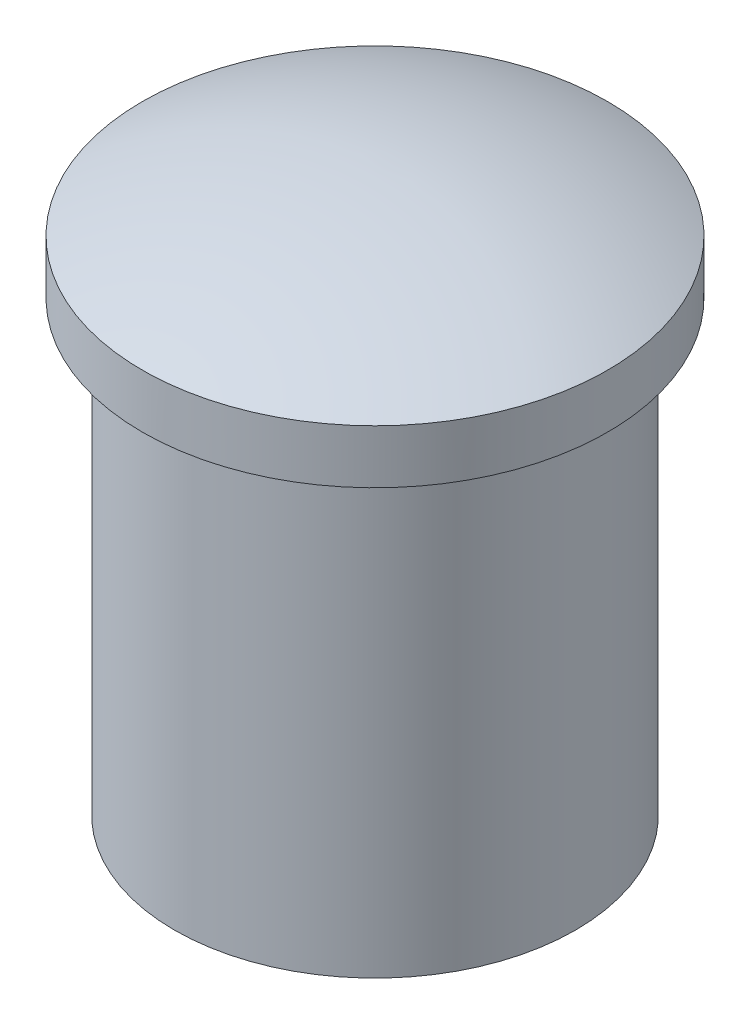
ISO-10303-21;
HEADER;
FILE_DESCRIPTION(('STEP AP214'),'2;1');
FILE_NAME('part.step','',(''),(''),'','','');
FILE_SCHEMA(('AUTOMOTIVE_DESIGN { 1 0 10303 214 1 1 1 1 }'));
ENDSEC;
DATA;
#1=APPLICATION_CONTEXT('core data for automotive mechanical design processes');
#2=APPLICATION_PROTOCOL_DEFINITION('international standard','automotive_design',2000,#1);
#3=PRODUCT_CONTEXT('',#1,'mechanical');
#4=PRODUCT('Part','Part','',(#3));
#5=PRODUCT_RELATED_PRODUCT_CATEGORY('part','',(#4));
#6=PRODUCT_DEFINITION_FORMATION('','',#4);
#7=PRODUCT_DEFINITION_CONTEXT('part definition',#1,'design');
#8=PRODUCT_DEFINITION('design','',#6,#7);
#9=PRODUCT_DEFINITION_SHAPE('','',#8);
#10=(LENGTH_UNIT() NAMED_UNIT(*) SI_UNIT(.MILLI.,.METRE.));
#11=(NAMED_UNIT(*) PLANE_ANGLE_UNIT() SI_UNIT($,.RADIAN.));
#12=(NAMED_UNIT(*) SI_UNIT($,.STERADIAN.) SOLID_ANGLE_UNIT());
#13=UNCERTAINTY_MEASURE_WITH_UNIT(LENGTH_MEASURE(1.E-05),#10,'distance_accuracy_value','');
#14=(GEOMETRIC_REPRESENTATION_CONTEXT(3) GLOBAL_UNCERTAINTY_ASSIGNED_CONTEXT((#13)) GLOBAL_UNIT_ASSIGNED_CONTEXT((#10,
#11,#12)) REPRESENTATION_CONTEXT('',''));
#15=CARTESIAN_POINT('',(0.,0.,0.));
#16=DIRECTION('',(0.,0.,1.));
#17=DIRECTION('',(1.,0.,0.));
#18=AXIS2_PLACEMENT_3D('',#15,#16,#17);
#19=CARTESIAN_POINT('',(0.,-5.461,0.));
#20=DIRECTION('',(0.,-1.,0.));
#21=DIRECTION('',(-1.,0.,0.));
#22=AXIS2_PLACEMENT_3D('',#19,#20,#21);
#23=SPHERICAL_SURFACE('',#22,2.6924);
#24=CARTESIAN_POINT('',(0.,-3.175,0.));
#25=DIRECTION('',(0.,-1.,0.));
#26=DIRECTION('',(0.,0.,-1.));
#27=AXIS2_PLACEMENT_3D('',#24,#25,#26);
#28=CIRCLE('',#27,1.4224);
#29=CARTESIAN_POINT('',(0.,-3.175,-1.4224));
#30=VERTEX_POINT('',#29);
#31=EDGE_CURVE('E10',#30,#30,#28,.T.);
#32=ORIENTED_EDGE('',*,*,#31,.T.);
#33=EDGE_LOOP('',(#32));
#34=FACE_BOUND('',#33,.T.);
#35=ADVANCED_FACE('F35',(#34),#23,.F.);
#36=CARTESIAN_POINT('',(0.,-2.7686,0.));
#37=DIRECTION('',(0.,-1.,0.));
#38=DIRECTION('',(0.,0.,-1.));
#39=AXIS2_PLACEMENT_3D('',#36,#37,#38);
#40=CYLINDRICAL_SURFACE('',#39,1.4224);
#41=ORIENTED_EDGE('',*,*,#31,.F.);
#42=EDGE_LOOP('',(#41));
#43=FACE_BOUND('',#42,.T.);
#44=CARTESIAN_POINT('',(0.,0.,0.));
#45=DIRECTION('',(0.,-1.,0.));
#46=DIRECTION('',(0.,0.,-1.));
#47=AXIS2_PLACEMENT_3D('',#44,#45,#46);
#48=CIRCLE('',#47,1.4224);
#49=CARTESIAN_POINT('',(0.,0.,-1.4224));
#50=VERTEX_POINT('',#49);
#51=EDGE_CURVE('E41',#50,#50,#48,.T.);
#52=ORIENTED_EDGE('',*,*,#51,.T.);
#53=EDGE_LOOP('',(#52));
#54=FACE_BOUND('',#53,.T.);
#55=ADVANCED_FACE('F67',(#43,#54),#40,.T.);
#56=CARTESIAN_POINT('',(-1.651,0.,0.));
#57=DIRECTION('',(0.,1.,0.));
#58=DIRECTION('',(0.,0.,1.));
#59=AXIS2_PLACEMENT_3D('',#56,#57,#58);
#60=PLANE('',#59);
#61=ORIENTED_EDGE('',*,*,#51,.F.);
#62=EDGE_LOOP('',(#61));
#63=FACE_BOUND('',#62,.T.);
#64=CARTESIAN_POINT('',(0.,0.,0.));
#65=DIRECTION('',(0.,-1.,0.));
#66=DIRECTION('',(0.,0.,-1.));
#67=AXIS2_PLACEMENT_3D('',#64,#65,#66);
#68=CIRCLE('',#67,1.651);
#69=CARTESIAN_POINT('',(0.,0.,-1.651));
#70=VERTEX_POINT('',#69);
#71=EDGE_CURVE('E45',#70,#70,#68,.T.);
#72=ORIENTED_EDGE('',*,*,#71,.T.);
#73=EDGE_LOOP('',(#72));
#74=FACE_BOUND('',#73,.T.);
#75=ADVANCED_FACE('F63',(#63,#74),#60,.F.);
#76=CARTESIAN_POINT('',(0.,-2.7686,0.));
#77=DIRECTION('',(0.,-1.,0.));
#78=DIRECTION('',(0.,0.,-1.));
#79=AXIS2_PLACEMENT_3D('',#76,#77,#78);
#80=CYLINDRICAL_SURFACE('',#79,1.651);
#81=ORIENTED_EDGE('',*,*,#71,.F.);
#82=EDGE_LOOP('',(#81));
#83=FACE_BOUND('',#82,.T.);
#84=CARTESIAN_POINT('',(0.,0.381,0.));
#85=DIRECTION('',(0.,-1.,0.));
#86=DIRECTION('',(0.,0.,-1.));
#87=AXIS2_PLACEMENT_3D('',#84,#85,#86);
#88=CIRCLE('',#87,1.651);
#89=CARTESIAN_POINT('',(0.,0.381,-1.651));
#90=VERTEX_POINT('',#89);
#91=EDGE_CURVE('E49',#90,#90,#88,.T.);
#92=ORIENTED_EDGE('',*,*,#91,.T.);
#93=EDGE_LOOP('',(#92));
#94=FACE_BOUND('',#93,.T.);
#95=ADVANCED_FACE('F55',(#83,#94),#80,.T.);
#96=CARTESIAN_POINT('',(0.,-3.00566666666666,0.));
#97=DIRECTION('',(0.,-1.,0.));
#98=DIRECTION('',(-1.,0.,0.));
#99=AXIS2_PLACEMENT_3D('',#96,#97,#98);
#100=SPHERICAL_SURFACE('',#99,3.76766666666666);
#101=ORIENTED_EDGE('',*,*,#91,.F.);
#102=EDGE_LOOP('',(#101));
#103=FACE_BOUND('',#102,.T.);
#104=ADVANCED_FACE('F57',(#103),#100,.T.);
#105=CLOSED_SHELL('',(#35,#55,#75,#95,#104));
#106=MANIFOLD_SOLID_BREP('B2',#105);
#107=ADVANCED_BREP_SHAPE_REPRESENTATION('',(#18,#106),#14);
#108=SHAPE_DEFINITION_REPRESENTATION(#9,#107);
ENDSEC;
END-ISO-10303-21;
